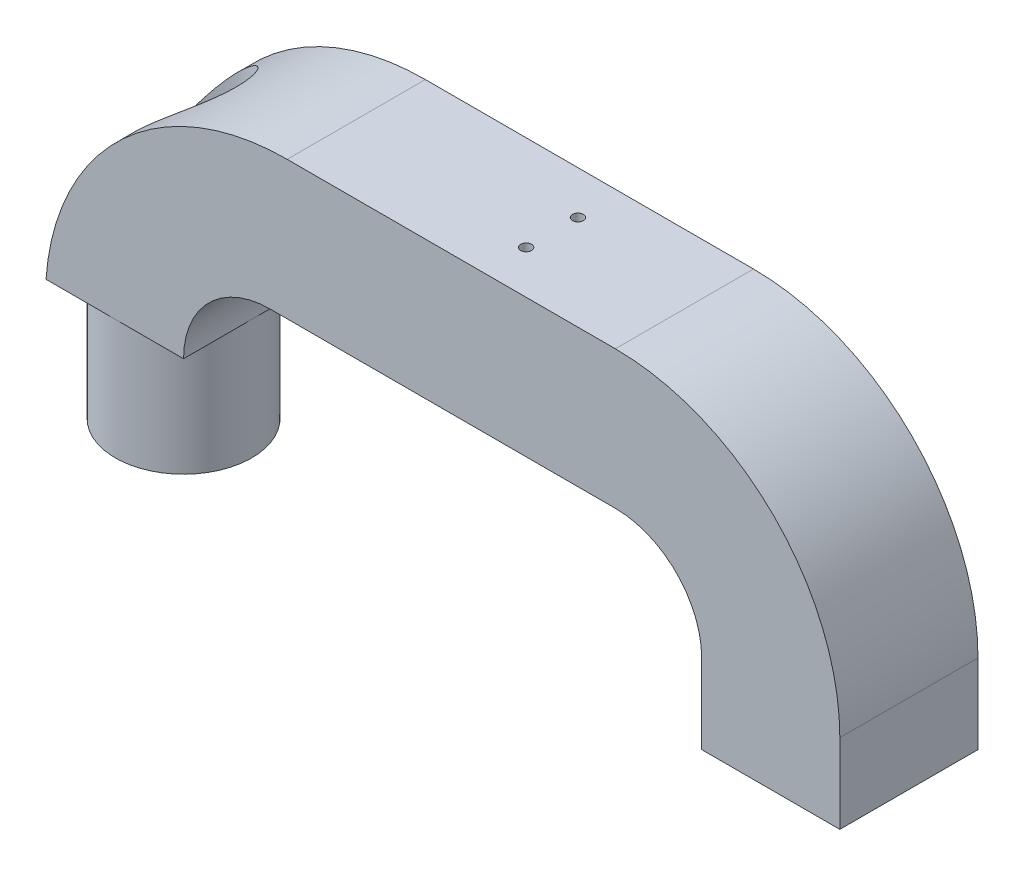
ISO-10303-21;
HEADER;
FILE_DESCRIPTION(('STEP AP214'),'2;1');
FILE_NAME('part.step','',(''),(''),'','','');
FILE_SCHEMA(('AUTOMOTIVE_DESIGN { 1 0 10303 214 1 1 1 1 }'));
ENDSEC;
DATA;
#1=APPLICATION_CONTEXT('core data for automotive mechanical design processes');
#2=APPLICATION_PROTOCOL_DEFINITION('international standard','automotive_design',2000,#1);
#3=PRODUCT_CONTEXT('',#1,'mechanical');
#4=PRODUCT('Part','Part','',(#3));
#5=PRODUCT_RELATED_PRODUCT_CATEGORY('part','',(#4));
#6=PRODUCT_DEFINITION_FORMATION('','',#4);
#7=PRODUCT_DEFINITION_CONTEXT('part definition',#1,'design');
#8=PRODUCT_DEFINITION('design','',#6,#7);
#9=PRODUCT_DEFINITION_SHAPE('','',#8);
#10=(LENGTH_UNIT() NAMED_UNIT(*) SI_UNIT(.MILLI.,.METRE.));
#11=(NAMED_UNIT(*) PLANE_ANGLE_UNIT() SI_UNIT($,.RADIAN.));
#12=(NAMED_UNIT(*) SI_UNIT($,.STERADIAN.) SOLID_ANGLE_UNIT());
#13=UNCERTAINTY_MEASURE_WITH_UNIT(LENGTH_MEASURE(1.E-05),#10,'distance_accuracy_value','');
#14=(GEOMETRIC_REPRESENTATION_CONTEXT(3) GLOBAL_UNCERTAINTY_ASSIGNED_CONTEXT((#13)) GLOBAL_UNIT_ASSIGNED_CONTEXT((#10,
#11,#12)) REPRESENTATION_CONTEXT('',''));
#15=CARTESIAN_POINT('',(0.,0.,0.));
#16=DIRECTION('',(0.,0.,1.));
#17=DIRECTION('',(1.,0.,0.));
#18=AXIS2_PLACEMENT_3D('',#15,#16,#17);
#19=CARTESIAN_POINT('',(140.,60.,79.9999999999999));
#20=DIRECTION('',(0.,0.,-1.));
#21=DIRECTION('',(-1.,0.,0.));
#22=AXIS2_PLACEMENT_3D('',#19,#20,#21);
#23=CYLINDRICAL_SURFACE('',#22,140.);
#24=CARTESIAN_POINT('',(40.,157.979589711327,9.49999999999995));
#25=CARTESIAN_POINT('',(40.9034415656146,158.901655034113,9.49999908355759));
#26=CARTESIAN_POINT('',(41.8197756052428,159.811338476659,9.54011979350592));
#27=CARTESIAN_POINT('',(43.6733487694005,161.601360563129,9.70771493960689));
#28=CARTESIAN_POINT('',(44.6105913099602,162.481694352425,9.83520375258552));
#29=CARTESIAN_POINT('',(46.4988331680101,164.207324416669,10.1849605684027));
#30=CARTESIAN_POINT('',(47.4498246231706,165.052639724943,10.4071763233364));
#31=CARTESIAN_POINT('',(49.3573848742276,166.702883245835,10.953948267275));
#32=CARTESIAN_POINT('',(50.3139519995339,167.507822924917,11.2784752075213));
#33=CARTESIAN_POINT('',(52.0106154171196,168.8980790837,11.9530014054682));
#34=CARTESIAN_POINT('',(52.7517745395391,169.492580254259,12.2814740002633));
#35=CARTESIAN_POINT('',(54.2246643589536,170.650208189659,13.007725014964));
#36=CARTESIAN_POINT('',(54.9563959834487,171.213338059287,13.405496560282));
#37=CARTESIAN_POINT('',(56.4031098869862,172.304857485795,14.2726017961209));
#38=CARTESIAN_POINT('',(57.1180948813089,172.833252699967,14.7419237915638));
#39=CARTESIAN_POINT('',(58.5232479398956,173.852061800982,15.7535846757366));
#40=CARTESIAN_POINT('',(59.2134156203289,174.342475100523,16.2959246931663));
#41=CARTESIAN_POINT('',(60.566098141244,175.286346802914,17.4591799090115));
#42=CARTESIAN_POINT('',(61.2282968919101,175.739419990506,18.0807776394611));
#43=CARTESIAN_POINT('',(62.5081623680673,176.600214672688,19.3972029894322));
#44=CARTESIAN_POINT('',(63.1258275411923,177.007934586608,20.0920331596379));
#45=CARTESIAN_POINT('',(64.3058370390901,177.774737318951,21.5512569246794));
#46=CARTESIAN_POINT('',(64.8682163657686,178.133850965371,22.3156059086796));
#47=CARTESIAN_POINT('',(65.9277122738552,178.801045345129,23.9090534735452));
#48=CARTESIAN_POINT('',(66.4248420620874,179.109136409001,24.7381388970896));
#49=CARTESIAN_POINT('',(67.2768723441445,179.630926785834,26.3283859127387));
#50=CARTESIAN_POINT('',(67.6419408718261,179.85184092375,27.0817557215735));
#51=CARTESIAN_POINT('',(68.3119526748404,180.253800858396,28.6249983647928));
#52=CARTESIAN_POINT('',(68.6169017850491,180.434850524363,29.4148676475352));
#53=CARTESIAN_POINT('',(69.1617578556217,180.756132611963,31.0242916175129));
#54=CARTESIAN_POINT('',(69.4017000281527,180.896387134056,31.8438299601419));
#55=CARTESIAN_POINT('',(69.812893100348,181.135571937841,33.5058471540467));
#56=CARTESIAN_POINT('',(69.9841495251769,181.234505543464,34.3483241542848));
#57=CARTESIAN_POINT('',(70.2405317298922,181.382189260322,35.9565033496266));
#58=CARTESIAN_POINT('',(70.3329672008411,181.435208227469,36.7206596054568));
#59=CARTESIAN_POINT('',(70.459788646314,181.507878060992,38.2553144658707));
#60=CARTESIAN_POINT('',(70.4941797693965,181.527531886871,39.0258125018429));
#61=CARTESIAN_POINT('',(70.5044618823485,181.533411864587,40.5671043830275));
#62=CARTESIAN_POINT('',(70.4803690737618,181.51964727418,41.3378980871855));
#63=CARTESIAN_POINT('',(70.3740368780232,181.458754352437,42.8741413541518));
#64=CARTESIAN_POINT('',(70.2917975158845,181.411626035454,43.6395909192588));
#65=CARTESIAN_POINT('',(70.0738698421387,181.286237925872,45.1346226909094));
#66=CARTESIAN_POINT('',(69.9400078233866,181.20904104452,45.8645615274191));
#67=CARTESIAN_POINT('',(69.6205260941961,181.023814626436,47.3090028897732));
#68=CARTESIAN_POINT('',(69.4349081085904,180.915786117204,48.0235059291801));
#69=CARTESIAN_POINT('',(69.0141572009635,180.669256648828,49.4323459388573));
#70=CARTESIAN_POINT('',(68.7790257567818,180.530756599168,50.1266835103074));
#71=CARTESIAN_POINT('',(68.2620197782249,180.223760156576,51.4908816688473));
#72=CARTESIAN_POINT('',(67.9801441303148,180.05526304905,52.1607416723714));
#73=CARTESIAN_POINT('',(67.3661874884284,179.684838481162,53.4865550714215));
#74=CARTESIAN_POINT('',(67.0331359195748,179.482255395258,54.1418754532937));
#75=CARTESIAN_POINT('',(66.3254575781901,179.047193308813,55.4192561208073));
#76=CARTESIAN_POINT('',(65.9508305776978,178.814714144348,56.0413162240523));
#77=CARTESIAN_POINT('',(65.1641253945081,178.320782280853,57.2492421366424));
#78=CARTESIAN_POINT('',(64.7520436925694,178.059326858708,57.8351045361482));
#79=CARTESIAN_POINT('',(63.8947972852608,177.508542881653,58.9682222548407));
#80=CARTESIAN_POINT('',(63.4496311901223,177.219213155683,59.515475950316));
#81=CARTESIAN_POINT('',(62.4956340211971,176.590838856586,60.6097708715932));
#82=CARTESIAN_POINT('',(61.9845361676312,176.249686449282,61.153625143726));
#83=CARTESIAN_POINT('',(60.9345922918481,175.53814713153,62.1932134063609));
#84=CARTESIAN_POINT('',(60.3957456142383,175.167759530473,62.6889462594969));
#85=CARTESIAN_POINT('',(59.2953774585477,174.399363505527,63.6318347089295));
#86=CARTESIAN_POINT('',(58.7338479434491,174.001345254968,64.0789728762796));
#87=CARTESIAN_POINT('',(57.5931292866188,173.179511371076,64.9246058231597));
#88=CARTESIAN_POINT('',(57.0139368502429,172.755690910013,65.3230914573679));
#89=CARTESIAN_POINT('',(56.0201398173457,172.016258363417,65.9584263393021));
#90=CARTESIAN_POINT('',(55.6088357794019,171.706766161022,66.2076687310619));
#91=CARTESIAN_POINT('',(54.7814589312948,171.076868497402,66.6830675787577));
#92=CARTESIAN_POINT('',(54.3653870505341,170.756465139878,66.9092284516399));
#93=CARTESIAN_POINT('',(53.1116313245347,169.779472837097,67.5539162234566));
#94=CARTESIAN_POINT('',(52.2685203971316,169.107185511466,67.9385767238795));
#95=CARTESIAN_POINT('',(50.5767286271123,167.724994323232,68.6219625231368));
#96=CARTESIAN_POINT('',(49.7280417920685,167.015040798995,68.9205708543951));
#97=CARTESIAN_POINT('',(48.0337675354842,165.562572933981,69.436246480028));
#98=CARTESIAN_POINT('',(47.1881802363915,164.820057321537,69.6533105866355));
#99=CARTESIAN_POINT('',(45.7833622779955,163.555790495448,69.9522180076802));
#100=CARTESIAN_POINT('',(45.2214709342241,163.041801668027,70.0550530651225));
#101=CARTESIAN_POINT('',(44.1034587189721,162.002138862469,70.2279933655356));
#102=CARTESIAN_POINT('',(43.5473382585813,161.476464060148,70.2980962922655));
#103=CARTESIAN_POINT('',(41.8894943563895,159.883310129986,70.461671843427));
#104=CARTESIAN_POINT('',(40.7983259794504,158.799735277904,70.5084034891217));
#105=CARTESIAN_POINT('',(38.6517147719055,156.596564217438,70.4891173485744));
#106=CARTESIAN_POINT('',(37.5963232965308,155.476920383643,70.4229439491843));
#107=CARTESIAN_POINT('',(35.528187884843,153.209412258808,70.1883392702431));
#108=CARTESIAN_POINT('',(34.5154438640791,152.061548023658,70.0199081931937));
#109=CARTESIAN_POINT('',(32.8559018960198,150.117748457429,69.6594342998766));
#110=CARTESIAN_POINT('',(32.1964631294231,149.327762061985,69.49254490071));
#111=CARTESIAN_POINT('',(30.8996189132962,147.739147254064,69.1185253650503));
#112=CARTESIAN_POINT('',(30.2622150748271,146.940518215271,68.9113922934813));
#113=CARTESIAN_POINT('',(29.0098868763743,145.335989246552,68.4589331593968));
#114=CARTESIAN_POINT('',(28.3949716457538,144.530086525785,68.2135917939635));
#115=CARTESIAN_POINT('',(27.1883335458971,142.912880156303,67.6865425049549));
#116=CARTESIAN_POINT('',(26.5966101165467,142.101576638579,67.4048354603675));
#117=CARTESIAN_POINT('',(25.4362334032209,140.474484227972,66.8062165371458));
#118=CARTESIAN_POINT('',(24.8675977397283,139.658692429458,66.4892784350813));
#119=CARTESIAN_POINT('',(23.7541056046675,138.024800164895,65.8213562293483));
#120=CARTESIAN_POINT('',(23.2092497404197,137.206699640451,65.470371256882));
#121=CARTESIAN_POINT('',(22.143771608418,135.570246952096,64.7350753637915));
#122=CARTESIAN_POINT('',(21.6231392152072,134.751895039906,64.3507785634368));
#123=CARTESIAN_POINT('',(20.6061455182107,133.116583553739,63.5488359264068));
#124=CARTESIAN_POINT('',(20.1097824817569,132.299623884396,63.1311924760785));
#125=CARTESIAN_POINT('',(19.0170660545524,130.459557506609,62.1503013186713));
#126=CARTESIAN_POINT('',(18.4278007096365,129.437432148525,61.5772188217846));
#127=CARTESIAN_POINT('',(17.5736037318152,127.912572241379,60.6755386809515));
#128=CARTESIAN_POINT('',(17.2937987238251,127.405630256353,60.3679408858892));
#129=CARTESIAN_POINT('',(16.7442249759152,126.395364562336,59.738127664599));
#130=CARTESIAN_POINT('',(16.4744562548338,125.892040860137,59.4159122109362));
#131=CARTESIAN_POINT('',(15.9458810668631,124.891408514421,58.7570586026999));
#132=CARTESIAN_POINT('',(15.6870469774863,124.394087302592,58.4204617230929));
#133=CARTESIAN_POINT('',(15.179825105227,123.405304613598,57.7311045094606));
#134=CARTESIAN_POINT('',(14.9314376777307,122.913843336191,57.3783436264017));
#135=CARTESIAN_POINT('',(14.4455781889116,121.938548808152,56.6556610961098));
#136=CARTESIAN_POINT('',(14.2081015012702,121.454712382725,56.2857468583736));
#137=CARTESIAN_POINT('',(13.7444537929056,120.496448404291,55.527198613722));
#138=CARTESIAN_POINT('',(13.5182814452148,120.02201975091,55.1385668145469));
#139=CARTESIAN_POINT('',(13.0897018800936,119.110203681023,54.3621646078057));
#140=CARTESIAN_POINT('',(12.8866707047373,118.67219574155,53.9754700647411));
#141=CARTESIAN_POINT('',(12.492042362633,117.8095635205,53.1817575889892));
#142=CARTESIAN_POINT('',(12.3004452862103,117.384939344663,52.7747394957997));
#143=CARTESIAN_POINT('',(11.9295676465288,116.552384284151,51.9377784399982));
#144=CARTESIAN_POINT('',(11.7502974878171,116.14446761608,51.507816642366));
#145=CARTESIAN_POINT('',(11.4056954719614,115.350626660422,50.6226795946067));
#146=CARTESIAN_POINT('',(11.24036124563,114.964698638269,50.1675086520684));
#147=CARTESIAN_POINT('',(10.9570475615639,114.295680235268,49.3227520905613));
#148=CARTESIAN_POINT('',(10.8362043054868,114.007442387859,48.938217639191));
#149=CARTESIAN_POINT('',(10.6060684563427,113.45372122701,48.1495727598095));
#150=CARTESIAN_POINT('',(10.4967772616613,113.18824066909,47.745459970441));
#151=CARTESIAN_POINT('',(10.2917412405256,112.686250403862,46.9174340020904));
#152=CARTESIAN_POINT('',(10.1959679290444,112.449679922583,46.4935650405405));
#153=CARTESIAN_POINT('',(10.0199076289387,112.011837814137,45.6249524048128));
#154=CARTESIAN_POINT('',(9.93961031821771,111.810542667413,45.1802228919624));
#155=CARTESIAN_POINT('',(9.82003339881627,111.509159257993,44.4177735480277));
#156=CARTESIAN_POINT('',(9.77588206510267,111.397381175694,44.1054226737677));
#157=CARTESIAN_POINT('',(9.69665649754668,111.19619482708,43.4725989712331));
#158=CARTESIAN_POINT('',(9.66157701174856,111.106773618724,43.1521309607314));
#159=CARTESIAN_POINT('',(9.60128077701514,110.952731923191,42.504684059606));
#160=CARTESIAN_POINT('',(9.57605390520436,110.888085982437,42.1777122162518));
#161=CARTESIAN_POINT('',(9.53605922830053,110.785462624785,41.5189393678523));
#162=CARTESIAN_POINT('',(9.52129137841304,110.747485093671,41.1871383834958));
#163=CARTESIAN_POINT('',(9.50258627974373,110.699365855972,40.5194684641821));
#164=CARTESIAN_POINT('',(9.49870555213914,110.689369415574,40.1835873589728));
#165=CARTESIAN_POINT('',(9.50205272203859,110.697985903836,39.5122599253387));
#166=CARTESIAN_POINT('',(9.50928039987777,110.716598266767,39.1768135884479));
#167=CARTESIAN_POINT('',(9.53463912037537,110.781796107821,38.5088284821384));
#168=CARTESIAN_POINT('',(9.55277853240589,110.828403057937,38.1762921435391));
#169=CARTESIAN_POINT('',(9.59945830824546,110.948040458174,37.5167694398886));
#170=CARTESIAN_POINT('',(9.62800002420722,111.021074343415,37.1897838021358));
#171=CARTESIAN_POINT('',(9.70246244848821,111.210978509463,36.4688621274706));
#172=CARTESIAN_POINT('',(9.75087003299376,111.334066619772,36.0768164996785));
#173=CARTESIAN_POINT('',(9.86081708717038,111.612164567542,35.3062427642111));
#174=CARTESIAN_POINT('',(9.92236023261771,111.767183339862,34.9277184749489));
#175=CARTESIAN_POINT('',(10.1246321636226,112.273508944162,33.8126147595238));
#176=CARTESIAN_POINT('',(10.2828892948316,112.665789325682,33.0975407215667));
#177=CARTESIAN_POINT('',(10.5362156286167,113.283868435473,32.1112758061552));
#178=CARTESIAN_POINT('',(10.6168997608811,113.479540720242,31.8161988366431));
#179=CARTESIAN_POINT('',(10.7845503370616,113.883348532052,31.2365314884774));
#180=CARTESIAN_POINT('',(10.8715155734424,114.0914816622,30.9519391099754));
#181=CARTESIAN_POINT('',(11.1410901214833,114.732034244688,30.1126682061699));
#182=CARTESIAN_POINT('',(11.3322790245741,115.180363515001,29.572875018011));
#183=CARTESIAN_POINT('',(11.7344928370396,116.108972372397,28.527181260013));
#184=CARTESIAN_POINT('',(11.9455671862196,116.589330676679,28.0213708229971));
#185=CARTESIAN_POINT('',(12.3847991863945,117.573003045295,27.0408688144099));
#186=CARTESIAN_POINT('',(12.6129526415605,118.07631145967,26.5661696531186));
#187=CARTESIAN_POINT('',(13.1061431006296,119.146657007511,25.6024517875123));
#188=CARTESIAN_POINT('',(13.3726494745547,119.715339633262,25.1160243761681));
#189=CARTESIAN_POINT('',(13.9227789781839,120.86823934554,24.1719561831716));
#190=CARTESIAN_POINT('',(14.2064059333539,121.452459887464,23.7143218821256));
#191=CARTESIAN_POINT('',(14.7900309346141,122.633040053123,22.8247076004192));
#192=CARTESIAN_POINT('',(15.0900434860212,123.229410129563,22.3927510811222));
#193=CARTESIAN_POINT('',(15.7055167005021,124.430870213418,21.5528025542956));
#194=CARTESIAN_POINT('',(16.0209762225115,125.035959574418,21.1448087815255));
#195=CARTESIAN_POINT('',(16.6674538951776,126.253748338674,20.3504466285269));
#196=CARTESIAN_POINT('',(16.9984979187898,126.866459058432,19.9641167231796));
#197=CARTESIAN_POINT('',(17.6753104272669,128.096719951908,19.2126503064264));
#198=CARTESIAN_POINT('',(18.0210790958291,128.714270185924,18.8475140595563));
#199=CARTESIAN_POINT('',(18.7269446795884,129.952510489602,18.137761104156));
#200=CARTESIAN_POINT('',(19.0870353191416,130.573199082253,17.7931355698914));
#201=CARTESIAN_POINT('',(19.8215090591611,131.816793635677,17.1236937908251));
#202=CARTESIAN_POINT('',(20.1958922499152,132.439699610435,16.7988776711957));
#203=CARTESIAN_POINT('',(21.008336299692,133.767648118272,16.1278576608353));
#204=CARTESIAN_POINT('',(21.4483549135253,134.472857270883,15.7843501215134));
#205=CARTESIAN_POINT('',(22.3463108955541,135.883519713128,15.1221291641871));
#206=CARTESIAN_POINT('',(22.8042485446389,136.588973006419,14.8034161350826));
#207=CARTESIAN_POINT('',(23.7380216333939,137.999151978728,14.1908948177474));
#208=CARTESIAN_POINT('',(24.2138617435779,138.703877417896,13.8970930945082));
#209=CARTESIAN_POINT('',(25.1831797552932,140.111347074364,13.334934318147));
#210=CARTESIAN_POINT('',(25.6766576073007,140.814091297221,13.0665771935887));
#211=CARTESIAN_POINT('',(26.6796586961702,142.214597218246,12.5567112996828));
#212=CARTESIAN_POINT('',(27.1891324175881,142.912367396959,12.3151284906734));
#213=CARTESIAN_POINT('',(28.2252356149199,144.303941358386,11.8588318794133));
#214=CARTESIAN_POINT('',(28.7518648534973,144.997745195816,11.6441177056497));
#215=CARTESIAN_POINT('',(29.8217928962661,146.380126648374,11.2427326878813));
#216=CARTESIAN_POINT('',(30.3650846842828,147.068706314962,11.0560502304842));
#217=CARTESIAN_POINT('',(31.4682098616465,148.439950540812,10.7119069327292));
#218=CARTESIAN_POINT('',(32.0280438348849,149.122614890177,10.5544471252779));
#219=CARTESIAN_POINT('',(33.1806392970149,150.501133222613,10.2660188509942));
#220=CARTESIAN_POINT('',(33.7738849121957,151.196777023799,10.1359757334332));
#221=CARTESIAN_POINT('',(34.9766838540282,152.579385204643,9.91028962958153));
#222=CARTESIAN_POINT('',(35.5862354140927,153.266350512752,9.81464293286685));
#223=CARTESIAN_POINT('',(36.8214387030317,154.631031680331,9.65968823168949));
#224=CARTESIAN_POINT('',(37.447104672715,155.308738487746,9.6004136046934));
#225=CARTESIAN_POINT('',(38.7129761451216,156.652943490452,9.5205668509044));
#226=CARTESIAN_POINT('',(39.3531838611348,157.319439952266,9.50000065612397));
#227=CARTESIAN_POINT('',(40.,157.979589711327,9.49999999999995));
#228=B_SPLINE_CURVE_WITH_KNOTS('',3,(#24,#25,#26,#27,#28,#29,#30,#31,#32,#33,#34,#35,#36,#37,
#38,#39,#40,#41,#42,#43,#44,#45,#46,#47,#48,#49,#50,#51,#52,#53,#54,#55,#56,#57,#58,#59,#60,#61,
#62,#63,#64,#65,#66,#67,#68,#69,#70,#71,#72,#73,#74,#75,#76,#77,#78,#79,#80,#81,#82,#83,#84,#85,
#86,#87,#88,#89,#90,#91,#92,#93,#94,#95,#96,#97,#98,#99,#100,#101,#102,#103,#104,#105,#106,#107,
#108,#109,#110,#111,#112,#113,#114,#115,#116,#117,#118,#119,#120,#121,#122,#123,#124,#125,#126,
#127,#128,#129,#130,#131,#132,#133,#134,#135,#136,#137,#138,#139,#140,#141,#142,#143,#144,#145,
#146,#147,#148,#149,#150,#151,#152,#153,#154,#155,#156,#157,#158,#159,#160,#161,#162,#163,#164,
#165,#166,#167,#168,#169,#170,#171,#172,#173,#174,#175,#176,#177,#178,#179,#180,#181,#182,#183,
#184,#185,#186,#187,#188,#189,#190,#191,#192,#193,#194,#195,#196,#197,#198,#199,#200,#201,#202,
#203,#204,#205,#206,#207,#208,#209,#210,#211,#212,#213,#214,#215,#216,#217,#218,#219,#220,#221,
#222,#223,#224,#225,#226,#227),.UNSPECIFIED.,.T.,.F.,(4,2,2,2,2,2,2,2,2,2,2,2,2,2,2,2,2,2,2,2,2,
2,2,2,2,2,2,2,2,2,2,2,2,2,2,2,2,2,2,2,2,2,2,2,2,2,2,2,2,2,2,2,2,2,2,2,2,2,2,2,2,2,2,2,2,2,2,2,2,
2,2,2,2,2,2,2,2,2,2,2,2,2,2,2,2,2,2,2,2,2,2,2,2,2,2,2,2,2,2,2,2,4),(0.,3.87212553084022,
7.74488839091811,11.6155179353497,15.4850419446871,18.4983236467348,21.5113065955462,
24.5237975926516,27.5363351616637,30.5768317092945,33.6174341923635,36.6560990781928,
39.6941479718755,42.2880165200558,44.8816331968634,47.4738421733326,50.0658425875394,
52.3776369815952,54.6892263077224,57.0001753376108,59.3111233733858,61.5468737590559,
63.7825496444289,66.0181588105315,68.2538212407105,70.5388152842008,72.8238218571054,
75.1090433514633,77.3943608949139,79.8536327971738,82.3129628110223,84.773171996123,
87.2338429224001,88.948988703189,90.6638056508674,94.0939114291606,97.528657867882,
100.96353856544,103.268045501177,105.572715487234,110.182208321359,114.798059394484,
119.413901326833,122.540410277003,125.667147337276,128.795139932299,131.923056935351,
135.053317921554,138.183658805826,141.312679224887,144.441475925882,148.374399287464,
150.341200321582,152.308005047223,154.269501259127,156.231064145539,158.19178747523,
160.152280100892,162.007425827681,163.862586207508,165.719293689588,167.575684881545,
169.061413888325,170.547322538223,172.030051762986,173.511788596742,174.514971595693,
175.517572516175,176.519140606931,177.520704408094,178.527458352942,179.534192389835,
180.541699584696,181.549337788008,182.788629642711,184.02826874913,186.510758566059,
187.599993233032,188.68901905038,190.86844935715,193.053448905181,195.237913414326,
197.620050811718,200.002722464444,202.387538682838,204.772179000364,207.160928374842,
209.549707558893,211.937451309822,214.325210146914,217.022898909525,219.720629976645,
222.419069793802,225.117502034798,227.808275545097,230.499011845929,233.188630294816,
235.878343793127,238.647916473327,241.41719030344,244.18900162048,246.961237679108),.UNSPECIFIED.);
#229=CARTESIAN_POINT('',(40.,157.979589711327,9.49999999999995));
#230=VERTEX_POINT('',#229);
#231=EDGE_CURVE('E275',#230,#230,#228,.T.);
#232=ORIENTED_EDGE('',*,*,#231,.T.);
#233=EDGE_LOOP('',(#232));
#234=FACE_BOUND('',#233,.T.);
#235=DIRECTION('',(0.,0.,-1.));
#236=VECTOR('',#235,1.);
#237=CARTESIAN_POINT('',(0.357599562310573,70.,80.));
#238=LINE('',#237,#236);
#239=CARTESIAN_POINT('',(0.357599562310573,70.,80.));
#240=VERTEX_POINT('',#239);
#241=CARTESIAN_POINT('',(0.357599562310629,70.,0.));
#242=VERTEX_POINT('',#241);
#243=EDGE_CURVE('E70',#240,#242,#238,.T.);
#244=ORIENTED_EDGE('',*,*,#243,.F.);
#245=CARTESIAN_POINT('',(140.,60.,79.9999999999999));
#246=DIRECTION('',(0.,0.,1.));
#247=DIRECTION('',(1.,0.,0.));
#248=AXIS2_PLACEMENT_3D('',#245,#246,#247);
#249=CIRCLE('',#248,140.);
#250=CARTESIAN_POINT('',(140.000000000001,200.,79.9999999999999));
#251=VERTEX_POINT('',#250);
#252=EDGE_CURVE('E203',#251,#240,#249,.T.);
#253=ORIENTED_EDGE('',*,*,#252,.F.);
#254=DIRECTION('',(0.,0.,-1.));
#255=VECTOR('',#254,1.);
#256=CARTESIAN_POINT('',(140.000000000001,200.,79.9999999999999));
#257=LINE('',#256,#255);
#258=CARTESIAN_POINT('',(140.000000000001,200.,0.));
#259=VERTEX_POINT('',#258);
#260=EDGE_CURVE('E79',#251,#259,#257,.T.);
#261=ORIENTED_EDGE('',*,*,#260,.T.);
#262=CARTESIAN_POINT('',(140.,60.,-1.11022302462516E-13));
#263=DIRECTION('',(0.,0.,1.));
#264=DIRECTION('',(1.,0.,0.));
#265=AXIS2_PLACEMENT_3D('',#262,#263,#264);
#266=CIRCLE('',#265,140.);
#267=EDGE_CURVE('E172',#259,#242,#266,.T.);
#268=ORIENTED_EDGE('',*,*,#267,.T.);
#269=EDGE_LOOP('',(#244,#253,#261,#268));
#270=FACE_BOUND('',#269,.T.);
#271=ADVANCED_FACE('F55',(#234,#270),#23,.T.);
#272=CARTESIAN_POINT('',(140.,60.,79.9999999999999));
#273=DIRECTION('',(0.,0.,1.));
#274=DIRECTION('',(1.,0.,0.));
#275=AXIS2_PLACEMENT_3D('',#272,#273,#274);
#276=PLANE('',#275);
#277=ORIENTED_EDGE('',*,*,#252,.T.);
#278=DIRECTION('',(1.,0.,0.));
#279=VECTOR('',#278,1.);
#280=CARTESIAN_POINT('',(140.,70.,80.));
#281=LINE('',#280,#279);
#282=CARTESIAN_POINT('',(80.,70.,80.));
#283=VERTEX_POINT('',#282);
#284=EDGE_CURVE('E176',#240,#283,#281,.T.);
#285=ORIENTED_EDGE('',*,*,#284,.T.);
#286=CARTESIAN_POINT('',(130.,70.,80.));
#287=DIRECTION('',(0.,0.,1.));
#288=DIRECTION('',(1.,0.,0.));
#289=AXIS2_PLACEMENT_3D('',#286,#287,#288);
#290=CIRCLE('',#289,50.);
#291=CARTESIAN_POINT('',(130.,120.,80.));
#292=VERTEX_POINT('',#291);
#293=EDGE_CURVE('E230',#292,#283,#290,.T.);
#294=ORIENTED_EDGE('',*,*,#293,.F.);
#295=DIRECTION('',(1.,0.,0.));
#296=VECTOR('',#295,1.);
#297=CARTESIAN_POINT('',(130.,120.,80.));
#298=LINE('',#297,#296);
#299=CARTESIAN_POINT('',(330.,120.,80.));
#300=VERTEX_POINT('',#299);
#301=EDGE_CURVE('E240',#292,#300,#298,.T.);
#302=ORIENTED_EDGE('',*,*,#301,.T.);
#303=CARTESIAN_POINT('',(330.,70.,80.));
#304=DIRECTION('',(0.,0.,-1.));
#305=DIRECTION('',(-1.,0.,0.));
#306=AXIS2_PLACEMENT_3D('',#303,#304,#305);
#307=CIRCLE('',#306,50.);
#308=CARTESIAN_POINT('',(380.,69.9999999999996,80.));
#309=VERTEX_POINT('',#308);
#310=EDGE_CURVE('E243',#300,#309,#307,.T.);
#311=ORIENTED_EDGE('',*,*,#310,.T.);
#312=DIRECTION('',(0.,-1.,0.));
#313=VECTOR('',#312,1.);
#314=CARTESIAN_POINT('',(380.,69.9999999999996,80.));
#315=LINE('',#314,#313);
#316=CARTESIAN_POINT('',(380.,24.,79.9999999999999));
#317=VERTEX_POINT('',#316);
#318=EDGE_CURVE('E254',#309,#317,#315,.T.);
#319=ORIENTED_EDGE('',*,*,#318,.T.);
#320=DIRECTION('',(-1.,0.,0.));
#321=VECTOR('',#320,1.);
#322=CARTESIAN_POINT('',(460.,24.,80.));
#323=LINE('',#322,#321);
#324=CARTESIAN_POINT('',(460.,24.,80.));
#325=VERTEX_POINT('',#324);
#326=EDGE_CURVE('E160',#325,#317,#323,.T.);
#327=ORIENTED_EDGE('',*,*,#326,.F.);
#328=DIRECTION('',(0.,-1.,0.));
#329=VECTOR('',#328,1.);
#330=CARTESIAN_POINT('',(460.,69.9999999999991,79.9999999999999));
#331=LINE('',#330,#329);
#332=CARTESIAN_POINT('',(460.,69.9999999999991,79.9999999999999));
#333=VERTEX_POINT('',#332);
#334=EDGE_CURVE('E141',#333,#325,#331,.T.);
#335=ORIENTED_EDGE('',*,*,#334,.F.);
#336=CARTESIAN_POINT('',(330.,70.,80.));
#337=DIRECTION('',(0.,0.,-1.));
#338=DIRECTION('',(-1.,0.,0.));
#339=AXIS2_PLACEMENT_3D('',#336,#337,#338);
#340=CIRCLE('',#339,130.);
#341=CARTESIAN_POINT('',(329.999999999999,200.,80.));
#342=VERTEX_POINT('',#341);
#343=EDGE_CURVE('E158',#342,#333,#340,.T.);
#344=ORIENTED_EDGE('',*,*,#343,.F.);
#345=DIRECTION('',(1.,0.,0.));
#346=VECTOR('',#345,1.);
#347=CARTESIAN_POINT('',(140.000000000001,200.,79.9999999999999));
#348=LINE('',#347,#346);
#349=EDGE_CURVE('E165',#251,#342,#348,.T.);
#350=ORIENTED_EDGE('',*,*,#349,.F.);
#351=EDGE_LOOP('',(#277,#285,#294,#302,#311,#319,#327,#335,#344,#350));
#352=FACE_BOUND('',#351,.T.);
#353=ADVANCED_FACE('F156',(#352),#276,.T.);
#354=CARTESIAN_POINT('',(140.,60.,-1.11022302462516E-13));
#355=DIRECTION('',(0.,0.,1.));
#356=DIRECTION('',(1.,0.,0.));
#357=AXIS2_PLACEMENT_3D('',#354,#355,#356);
#358=PLANE('',#357);
#359=DIRECTION('',(1.,0.,0.));
#360=VECTOR('',#359,1.);
#361=CARTESIAN_POINT('',(140.,70.,0.));
#362=LINE('',#361,#360);
#363=CARTESIAN_POINT('',(80.,70.,-1.11022302462516E-13));
#364=VERTEX_POINT('',#363);
#365=EDGE_CURVE('E14',#242,#364,#362,.T.);
#366=ORIENTED_EDGE('',*,*,#365,.F.);
#367=ORIENTED_EDGE('',*,*,#267,.F.);
#368=DIRECTION('',(1.,0.,0.));
#369=VECTOR('',#368,1.);
#370=CARTESIAN_POINT('',(140.000000000001,200.,0.));
#371=LINE('',#370,#369);
#372=CARTESIAN_POINT('',(329.999999999999,200.,0.));
#373=VERTEX_POINT('',#372);
#374=EDGE_CURVE('E199',#259,#373,#371,.T.);
#375=ORIENTED_EDGE('',*,*,#374,.T.);
#376=CARTESIAN_POINT('',(330.,70.,-1.11022302462516E-13));
#377=DIRECTION('',(0.,0.,-1.));
#378=DIRECTION('',(-1.,0.,0.));
#379=AXIS2_PLACEMENT_3D('',#376,#377,#378);
#380=CIRCLE('',#379,130.);
#381=CARTESIAN_POINT('',(460.,69.9999999999991,0.));
#382=VERTEX_POINT('',#381);
#383=EDGE_CURVE('E196',#373,#382,#380,.T.);
#384=ORIENTED_EDGE('',*,*,#383,.T.);
#385=DIRECTION('',(0.,-1.,0.));
#386=VECTOR('',#385,1.);
#387=CARTESIAN_POINT('',(460.,69.9999999999991,0.));
#388=LINE('',#387,#386);
#389=CARTESIAN_POINT('',(460.,24.,0.));
#390=VERTEX_POINT('',#389);
#391=EDGE_CURVE('E143',#382,#390,#388,.T.);
#392=ORIENTED_EDGE('',*,*,#391,.T.);
#393=DIRECTION('',(-1.,0.,0.));
#394=VECTOR('',#393,1.);
#395=CARTESIAN_POINT('',(460.,24.,0.));
#396=LINE('',#395,#394);
#397=CARTESIAN_POINT('',(380.,24.,-1.11022302462516E-13));
#398=VERTEX_POINT('',#397);
#399=EDGE_CURVE('E190',#390,#398,#396,.T.);
#400=ORIENTED_EDGE('',*,*,#399,.T.);
#401=DIRECTION('',(0.,-1.,0.));
#402=VECTOR('',#401,1.);
#403=CARTESIAN_POINT('',(380.,69.9999999999996,-1.11022302462516E-13));
#404=LINE('',#403,#402);
#405=CARTESIAN_POINT('',(380.,69.9999999999996,-1.11022302462516E-13));
#406=VERTEX_POINT('',#405);
#407=EDGE_CURVE('E186',#406,#398,#404,.T.);
#408=ORIENTED_EDGE('',*,*,#407,.F.);
#409=CARTESIAN_POINT('',(330.,70.,-1.11022302462516E-13));
#410=DIRECTION('',(0.,0.,-1.));
#411=DIRECTION('',(-1.,0.,0.));
#412=AXIS2_PLACEMENT_3D('',#409,#410,#411);
#413=CIRCLE('',#412,50.);
#414=CARTESIAN_POINT('',(330.,120.,0.));
#415=VERTEX_POINT('',#414);
#416=EDGE_CURVE('E183',#415,#406,#413,.T.);
#417=ORIENTED_EDGE('',*,*,#416,.F.);
#418=DIRECTION('',(1.,0.,0.));
#419=VECTOR('',#418,1.);
#420=CARTESIAN_POINT('',(235.,120.,0.));
#421=LINE('',#420,#419);
#422=CARTESIAN_POINT('',(130.,120.,-1.11022302462516E-13));
#423=VERTEX_POINT('',#422);
#424=EDGE_CURVE('E180',#423,#415,#421,.T.);
#425=ORIENTED_EDGE('',*,*,#424,.F.);
#426=CARTESIAN_POINT('',(130.,70.,-1.11022302462516E-13));
#427=DIRECTION('',(0.,0.,1.));
#428=DIRECTION('',(1.,0.,0.));
#429=AXIS2_PLACEMENT_3D('',#426,#427,#428);
#430=CIRCLE('',#429,50.);
#431=EDGE_CURVE('E175',#423,#364,#430,.T.);
#432=ORIENTED_EDGE('',*,*,#431,.T.);
#433=EDGE_LOOP('',(#366,#367,#375,#384,#392,#400,#408,#417,#425,#432));
#434=FACE_BOUND('',#433,.T.);
#435=ADVANCED_FACE('F234',(#434),#358,.F.);
#436=CARTESIAN_POINT('',(130.,70.,80.));
#437=DIRECTION('',(0.,0.,-1.));
#438=DIRECTION('',(-1.,0.,0.));
#439=AXIS2_PLACEMENT_3D('',#436,#437,#438);
#440=CYLINDRICAL_SURFACE('',#439,50.);
#441=ORIENTED_EDGE('',*,*,#431,.F.);
#442=DIRECTION('',(0.,0.,-1.));
#443=VECTOR('',#442,1.);
#444=CARTESIAN_POINT('',(130.,120.,80.));
#445=LINE('',#444,#443);
#446=EDGE_CURVE('E119',#292,#423,#445,.T.);
#447=ORIENTED_EDGE('',*,*,#446,.F.);
#448=ORIENTED_EDGE('',*,*,#293,.T.);
#449=DIRECTION('',(0.,0.,-1.));
#450=VECTOR('',#449,1.);
#451=CARTESIAN_POINT('',(80.,69.9999999999997,80.));
#452=LINE('',#451,#450);
#453=EDGE_CURVE('E64',#283,#364,#452,.T.);
#454=ORIENTED_EDGE('',*,*,#453,.T.);
#455=EDGE_LOOP('',(#441,#447,#448,#454));
#456=FACE_BOUND('',#455,.T.);
#457=ADVANCED_FACE('F227',(#456),#440,.F.);
#458=CARTESIAN_POINT('',(235.,120.,80.));
#459=DIRECTION('',(0.,1.,0.));
#460=DIRECTION('',(0.,0.,1.));
#461=AXIS2_PLACEMENT_3D('',#458,#459,#460);
#462=PLANE('',#461);
#463=CARTESIAN_POINT('',(253.349999999999,120.,55.));
#464=DIRECTION('',(0.,1.,0.));
#465=DIRECTION('',(-1.,0.,0.));
#466=AXIS2_PLACEMENT_3D('',#463,#464,#465);
#467=CIRCLE('',#466,3.14999999999999);
#468=CARTESIAN_POINT('',(250.199999999999,120.,55.));
#469=VERTEX_POINT('',#468);
#470=EDGE_CURVE('E481',#469,#469,#467,.T.);
#471=ORIENTED_EDGE('',*,*,#470,.T.);
#472=EDGE_LOOP('',(#471));
#473=FACE_BOUND('',#472,.T.);
#474=CARTESIAN_POINT('',(253.349999999999,120.,25.));
#475=DIRECTION('',(0.,1.,0.));
#476=DIRECTION('',(-1.,0.,0.));
#477=AXIS2_PLACEMENT_3D('',#474,#475,#476);
#478=CIRCLE('',#477,3.14999999999999);
#479=CARTESIAN_POINT('',(250.199999999999,120.,25.));
#480=VERTEX_POINT('',#479);
#481=EDGE_CURVE('E485',#480,#480,#478,.T.);
#482=ORIENTED_EDGE('',*,*,#481,.T.);
#483=EDGE_LOOP('',(#482));
#484=FACE_BOUND('',#483,.T.);
#485=ORIENTED_EDGE('',*,*,#424,.T.);
#486=DIRECTION('',(0.,0.,-1.));
#487=VECTOR('',#486,1.);
#488=CARTESIAN_POINT('',(330.,120.,80.));
#489=LINE('',#488,#487);
#490=EDGE_CURVE('E217',#300,#415,#489,.T.);
#491=ORIENTED_EDGE('',*,*,#490,.F.);
#492=ORIENTED_EDGE('',*,*,#301,.F.);
#493=ORIENTED_EDGE('',*,*,#446,.T.);
#494=EDGE_LOOP('',(#485,#491,#492,#493));
#495=FACE_BOUND('',#494,.T.);
#496=ADVANCED_FACE('F239',(#473,#484,#495),#462,.F.);
#497=CARTESIAN_POINT('',(330.,70.,80.));
#498=DIRECTION('',(0.,0.,-1.));
#499=DIRECTION('',(-1.,0.,0.));
#500=AXIS2_PLACEMENT_3D('',#497,#498,#499);
#501=CYLINDRICAL_SURFACE('',#500,50.);
#502=ORIENTED_EDGE('',*,*,#416,.T.);
#503=DIRECTION('',(0.,0.,-1.));
#504=VECTOR('',#503,1.);
#505=CARTESIAN_POINT('',(380.,69.9999999999996,80.));
#506=LINE('',#505,#504);
#507=EDGE_CURVE('E213',#309,#406,#506,.T.);
#508=ORIENTED_EDGE('',*,*,#507,.F.);
#509=ORIENTED_EDGE('',*,*,#310,.F.);
#510=ORIENTED_EDGE('',*,*,#490,.T.);
#511=EDGE_LOOP('',(#502,#508,#509,#510));
#512=FACE_BOUND('',#511,.T.);
#513=ADVANCED_FACE('F318',(#512),#501,.F.);
#514=CARTESIAN_POINT('',(380.,69.9999999999996,80.));
#515=DIRECTION('',(1.,0.,0.));
#516=DIRECTION('',(0.,0.,-1.));
#517=AXIS2_PLACEMENT_3D('',#514,#515,#516);
#518=PLANE('',#517);
#519=ORIENTED_EDGE('',*,*,#407,.T.);
#520=DIRECTION('',(0.,0.,-1.));
#521=VECTOR('',#520,1.);
#522=CARTESIAN_POINT('',(380.,24.,79.9999999999999));
#523=LINE('',#522,#521);
#524=EDGE_CURVE('E210',#317,#398,#523,.T.);
#525=ORIENTED_EDGE('',*,*,#524,.F.);
#526=ORIENTED_EDGE('',*,*,#318,.F.);
#527=ORIENTED_EDGE('',*,*,#507,.T.);
#528=EDGE_LOOP('',(#519,#525,#526,#527));
#529=FACE_BOUND('',#528,.T.);
#530=ADVANCED_FACE('F315',(#529),#518,.F.);
#531=CARTESIAN_POINT('',(460.,24.,80.));
#532=DIRECTION('',(0.,-1.,0.));
#533=DIRECTION('',(1.,0.,0.));
#534=AXIS2_PLACEMENT_3D('',#531,#532,#533);
#535=PLANE('',#534);
#536=ORIENTED_EDGE('',*,*,#399,.F.);
#537=DIRECTION('',(0.,0.,-1.));
#538=VECTOR('',#537,1.);
#539=CARTESIAN_POINT('',(460.,24.,80.));
#540=LINE('',#539,#538);
#541=EDGE_CURVE('E149',#325,#390,#540,.T.);
#542=ORIENTED_EDGE('',*,*,#541,.F.);
#543=ORIENTED_EDGE('',*,*,#326,.T.);
#544=ORIENTED_EDGE('',*,*,#524,.T.);
#545=EDGE_LOOP('',(#536,#542,#543,#544));
#546=FACE_BOUND('',#545,.T.);
#547=ADVANCED_FACE('F260',(#546),#535,.T.);
#548=CARTESIAN_POINT('',(460.,69.9999999999991,79.9999999999999));
#549=DIRECTION('',(1.,0.,0.));
#550=DIRECTION('',(0.,0.,-1.));
#551=AXIS2_PLACEMENT_3D('',#548,#549,#550);
#552=PLANE('',#551);
#553=ORIENTED_EDGE('',*,*,#391,.F.);
#554=DIRECTION('',(0.,0.,-1.));
#555=VECTOR('',#554,1.);
#556=CARTESIAN_POINT('',(460.,69.9999999999991,79.9999999999999));
#557=LINE('',#556,#555);
#558=EDGE_CURVE('E138',#333,#382,#557,.T.);
#559=ORIENTED_EDGE('',*,*,#558,.F.);
#560=ORIENTED_EDGE('',*,*,#334,.T.);
#561=ORIENTED_EDGE('',*,*,#541,.T.);
#562=EDGE_LOOP('',(#553,#559,#560,#561));
#563=FACE_BOUND('',#562,.T.);
#564=ADVANCED_FACE('F140',(#563),#552,.T.);
#565=CARTESIAN_POINT('',(330.,70.,80.));
#566=DIRECTION('',(0.,0.,-1.));
#567=DIRECTION('',(-1.,0.,0.));
#568=AXIS2_PLACEMENT_3D('',#565,#566,#567);
#569=CYLINDRICAL_SURFACE('',#568,130.);
#570=ORIENTED_EDGE('',*,*,#383,.F.);
#571=DIRECTION('',(0.,0.,-1.));
#572=VECTOR('',#571,1.);
#573=CARTESIAN_POINT('',(329.999999999999,200.,80.));
#574=LINE('',#573,#572);
#575=EDGE_CURVE('E150',#342,#373,#574,.T.);
#576=ORIENTED_EDGE('',*,*,#575,.F.);
#577=ORIENTED_EDGE('',*,*,#343,.T.);
#578=ORIENTED_EDGE('',*,*,#558,.T.);
#579=EDGE_LOOP('',(#570,#576,#577,#578));
#580=FACE_BOUND('',#579,.T.);
#581=ADVANCED_FACE('F163',(#580),#569,.T.);
#582=CARTESIAN_POINT('',(140.000000000001,200.,79.9999999999999));
#583=DIRECTION('',(0.,1.,0.));
#584=DIRECTION('',(0.,0.,1.));
#585=AXIS2_PLACEMENT_3D('',#582,#583,#584);
#586=PLANE('',#585);
#587=CARTESIAN_POINT('',(253.349999999999,200.,55.));
#588=DIRECTION('',(0.,1.,0.));
#589=DIRECTION('',(0.,0.,1.));
#590=AXIS2_PLACEMENT_3D('',#587,#588,#589);
#591=CIRCLE('',#590,3.14999999999999);
#592=CARTESIAN_POINT('',(253.349999999999,200.,58.15));
#593=VERTEX_POINT('',#592);
#594=EDGE_CURVE('E478',#593,#593,#591,.T.);
#595=ORIENTED_EDGE('',*,*,#594,.F.);
#596=EDGE_LOOP('',(#595));
#597=FACE_BOUND('',#596,.T.);
#598=CARTESIAN_POINT('',(253.349999999999,200.,25.));
#599=DIRECTION('',(0.,1.,0.));
#600=DIRECTION('',(0.,0.,1.));
#601=AXIS2_PLACEMENT_3D('',#598,#599,#600);
#602=CIRCLE('',#601,3.14999999999999);
#603=CARTESIAN_POINT('',(253.349999999999,200.,28.15));
#604=VERTEX_POINT('',#603);
#605=EDGE_CURVE('E482',#604,#604,#602,.T.);
#606=ORIENTED_EDGE('',*,*,#605,.F.);
#607=EDGE_LOOP('',(#606));
#608=FACE_BOUND('',#607,.T.);
#609=ORIENTED_EDGE('',*,*,#374,.F.);
#610=ORIENTED_EDGE('',*,*,#260,.F.);
#611=ORIENTED_EDGE('',*,*,#349,.T.);
#612=ORIENTED_EDGE('',*,*,#575,.T.);
#613=EDGE_LOOP('',(#609,#610,#611,#612));
#614=FACE_BOUND('',#613,.T.);
#615=ADVANCED_FACE('F262',(#597,#608,#614),#586,.T.);
#616=CARTESIAN_POINT('',(40.,70.,40.));
#617=DIRECTION('',(0.,-1.,0.));
#618=DIRECTION('',(0.,0.,-1.));
#619=AXIS2_PLACEMENT_3D('',#616,#617,#618);
#620=PLANE('',#619);
#621=ORIENTED_EDGE('',*,*,#243,.T.);
#622=ORIENTED_EDGE('',*,*,#365,.T.);
#623=ORIENTED_EDGE('',*,*,#453,.F.);
#624=ORIENTED_EDGE('',*,*,#284,.F.);
#625=EDGE_LOOP('',(#621,#622,#623,#624));
#626=FACE_BOUND('',#625,.T.);
#627=CARTESIAN_POINT('',(40.,70.,40.));
#628=DIRECTION('',(0.,-1.,0.));
#629=DIRECTION('',(0.,0.,-1.));
#630=AXIS2_PLACEMENT_3D('',#627,#628,#629);
#631=CIRCLE('',#630,39.5);
#632=CARTESIAN_POINT('',(40.,70.,0.500000000000042));
#633=VERTEX_POINT('',#632);
#634=EDGE_CURVE('E264',#633,#633,#631,.T.);
#635=ORIENTED_EDGE('',*,*,#634,.F.);
#636=EDGE_LOOP('',(#635));
#637=FACE_BOUND('',#636,.T.);
#638=ADVANCED_FACE('F298',(#626,#637),#620,.T.);
#639=CARTESIAN_POINT('',(40.,70.,40.));
#640=DIRECTION('',(0.,-1.,0.));
#641=DIRECTION('',(0.,0.,-1.));
#642=AXIS2_PLACEMENT_3D('',#639,#640,#641);
#643=CYLINDRICAL_SURFACE('',#642,39.5);
#644=ORIENTED_EDGE('',*,*,#634,.T.);
#645=EDGE_LOOP('',(#644));
#646=FACE_BOUND('',#645,.T.);
#647=CARTESIAN_POINT('',(40.,0.,40.));
#648=DIRECTION('',(0.,-1.,0.));
#649=DIRECTION('',(0.,0.,-1.));
#650=AXIS2_PLACEMENT_3D('',#647,#648,#649);
#651=CIRCLE('',#650,39.5);
#652=CARTESIAN_POINT('',(40.,0.,0.500000000000042));
#653=VERTEX_POINT('',#652);
#654=EDGE_CURVE('E270',#653,#653,#651,.T.);
#655=ORIENTED_EDGE('',*,*,#654,.F.);
#656=EDGE_LOOP('',(#655));
#657=FACE_BOUND('',#656,.T.);
#658=ADVANCED_FACE('F295',(#646,#657),#643,.T.);
#659=CARTESIAN_POINT('',(0.,0.,80.));
#660=DIRECTION('',(0.,1.,0.));
#661=DIRECTION('',(0.,0.,1.));
#662=AXIS2_PLACEMENT_3D('',#659,#660,#661);
#663=PLANE('',#662);
#664=CARTESIAN_POINT('',(40.,0.,40.));
#665=DIRECTION('',(0.,-1.,0.));
#666=DIRECTION('',(0.,0.,-1.));
#667=AXIS2_PLACEMENT_3D('',#664,#665,#666);
#668=CIRCLE('',#667,30.5);
#669=CARTESIAN_POINT('',(40.,0.,9.50000000000004));
#670=VERTEX_POINT('',#669);
#671=EDGE_CURVE('E284',#670,#670,#668,.T.);
#672=ORIENTED_EDGE('',*,*,#671,.F.);
#673=EDGE_LOOP('',(#672));
#674=FACE_BOUND('',#673,.T.);
#675=ORIENTED_EDGE('',*,*,#654,.T.);
#676=EDGE_LOOP('',(#675));
#677=FACE_BOUND('',#676,.T.);
#678=ADVANCED_FACE('F292',(#674,#677),#663,.F.);
#679=CARTESIAN_POINT('',(40.,200.,40.));
#680=DIRECTION('',(0.,-1.,0.));
#681=DIRECTION('',(0.,0.,-1.));
#682=AXIS2_PLACEMENT_3D('',#679,#680,#681);
#683=CYLINDRICAL_SURFACE('',#682,30.5);
#684=ORIENTED_EDGE('',*,*,#671,.T.);
#685=EDGE_LOOP('',(#684));
#686=FACE_BOUND('',#685,.T.);
#687=ORIENTED_EDGE('',*,*,#231,.F.);
#688=EDGE_LOOP('',(#687));
#689=FACE_BOUND('',#688,.T.);
#690=ADVANCED_FACE('F286',(#686,#689),#683,.F.);
#691=CARTESIAN_POINT('',(253.349999999999,200.,25.));
#692=DIRECTION('',(0.,1.,0.));
#693=DIRECTION('',(0.,0.,1.));
#694=AXIS2_PLACEMENT_3D('',#691,#692,#693);
#695=CYLINDRICAL_SURFACE('',#694,3.14999999999999);
#696=ORIENTED_EDGE('',*,*,#605,.T.);
#697=EDGE_LOOP('',(#696));
#698=FACE_BOUND('',#697,.T.);
#699=ORIENTED_EDGE('',*,*,#481,.F.);
#700=EDGE_LOOP('',(#699));
#701=FACE_BOUND('',#700,.T.);
#702=ADVANCED_FACE('F291',(#698,#701),#695,.F.);
#703=CARTESIAN_POINT('',(253.349999999999,200.,55.));
#704=DIRECTION('',(0.,1.,0.));
#705=DIRECTION('',(0.,0.,1.));
#706=AXIS2_PLACEMENT_3D('',#703,#704,#705);
#707=CYLINDRICAL_SURFACE('',#706,3.14999999999999);
#708=ORIENTED_EDGE('',*,*,#594,.T.);
#709=EDGE_LOOP('',(#708));
#710=FACE_BOUND('',#709,.T.);
#711=ORIENTED_EDGE('',*,*,#470,.F.);
#712=EDGE_LOOP('',(#711));
#713=FACE_BOUND('',#712,.T.);
#714=ADVANCED_FACE('F405',(#710,#713),#707,.F.);
#715=CLOSED_SHELL('',(#271,#353,#435,#457,#496,#513,#530,#547,#564,#581,#615,#638,#658,#678,
#690,#702,#714));
#716=MANIFOLD_SOLID_BREP('B2',#715);
#717=ADVANCED_BREP_SHAPE_REPRESENTATION('',(#18,#716),#14);
#718=SHAPE_DEFINITION_REPRESENTATION(#9,#717);
ENDSEC;
END-ISO-10303-21;
